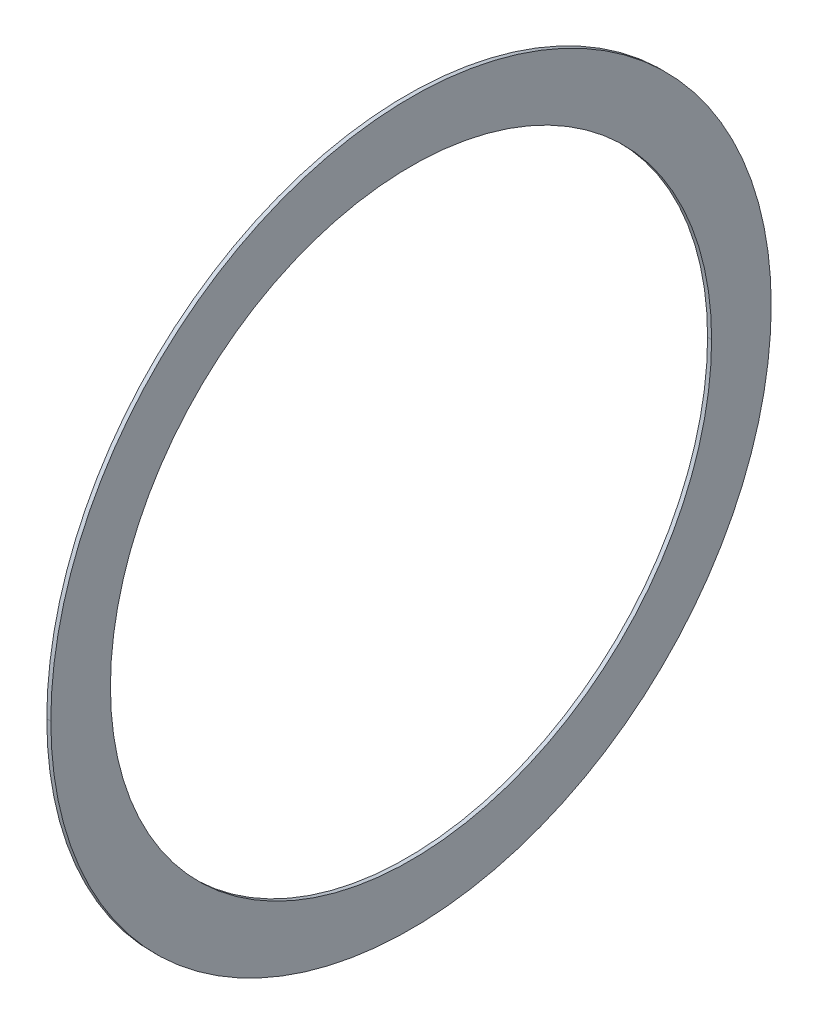
ISO-10303-21;
HEADER;
FILE_DESCRIPTION(('STEP AP214'),'2;1');
FILE_NAME('part.step','',(''),(''),'','','');
FILE_SCHEMA(('AUTOMOTIVE_DESIGN { 1 0 10303 214 1 1 1 1 }'));
ENDSEC;
DATA;
#1=APPLICATION_CONTEXT('core data for automotive mechanical design processes');
#2=APPLICATION_PROTOCOL_DEFINITION('international standard','automotive_design',2000,#1);
#3=PRODUCT_CONTEXT('',#1,'mechanical');
#4=PRODUCT('Part','Part','',(#3));
#5=PRODUCT_RELATED_PRODUCT_CATEGORY('part','',(#4));
#6=PRODUCT_DEFINITION_FORMATION('','',#4);
#7=PRODUCT_DEFINITION_CONTEXT('part definition',#1,'design');
#8=PRODUCT_DEFINITION('design','',#6,#7);
#9=PRODUCT_DEFINITION_SHAPE('','',#8);
#10=(LENGTH_UNIT() NAMED_UNIT(*) SI_UNIT(.MILLI.,.METRE.));
#11=(NAMED_UNIT(*) PLANE_ANGLE_UNIT() SI_UNIT($,.RADIAN.));
#12=(NAMED_UNIT(*) SI_UNIT($,.STERADIAN.) SOLID_ANGLE_UNIT());
#13=UNCERTAINTY_MEASURE_WITH_UNIT(LENGTH_MEASURE(1.E-05),#10,'distance_accuracy_value','');
#14=(GEOMETRIC_REPRESENTATION_CONTEXT(3) GLOBAL_UNCERTAINTY_ASSIGNED_CONTEXT((#13)) GLOBAL_UNIT_ASSIGNED_CONTEXT((#10,
#11,#12)) REPRESENTATION_CONTEXT('',''));
#15=CARTESIAN_POINT('',(0.,0.,0.));
#16=DIRECTION('',(0.,0.,1.));
#17=DIRECTION('',(1.,0.,0.));
#18=AXIS2_PLACEMENT_3D('',#15,#16,#17);
#19=CARTESIAN_POINT('',(0.,49.25,0.));
#20=DIRECTION('',(-1.,0.,0.));
#21=DIRECTION('',(0.,0.,1.));
#22=AXIS2_PLACEMENT_3D('',#19,#20,#21);
#23=PLANE('',#22);
#24=CARTESIAN_POINT('',(0.,0.,0.));
#25=DIRECTION('',(1.,0.,0.));
#26=DIRECTION('',(0.,0.,-1.));
#27=AXIS2_PLACEMENT_3D('',#24,#25,#26);
#28=CIRCLE('',#27,41.1);
#29=CARTESIAN_POINT('',(0.,0.,-41.1));
#30=VERTEX_POINT('',#29);
#31=CARTESIAN_POINT('',(0.,0.,41.1));
#32=VERTEX_POINT('',#31);
#33=EDGE_CURVE('E11',#30,#32,#28,.T.);
#34=ORIENTED_EDGE('',*,*,#33,.T.);
#35=CARTESIAN_POINT('',(0.,0.,0.));
#36=DIRECTION('',(1.,0.,0.));
#37=DIRECTION('',(0.,0.,-1.));
#38=AXIS2_PLACEMENT_3D('',#35,#36,#37);
#39=CIRCLE('',#38,41.1);
#40=EDGE_CURVE('E27',#32,#30,#39,.T.);
#41=ORIENTED_EDGE('',*,*,#40,.T.);
#42=EDGE_LOOP('',(#34,#41));
#43=FACE_BOUND('',#42,.T.);
#44=CARTESIAN_POINT('',(0.,0.,0.));
#45=DIRECTION('',(1.,0.,0.));
#46=DIRECTION('',(0.,0.,-1.));
#47=AXIS2_PLACEMENT_3D('',#44,#45,#46);
#48=CIRCLE('',#47,49.25);
#49=CARTESIAN_POINT('',(0.,0.,49.25));
#50=VERTEX_POINT('',#49);
#51=CARTESIAN_POINT('',(0.,0.,-49.25));
#52=VERTEX_POINT('',#51);
#53=EDGE_CURVE('E97',#50,#52,#48,.T.);
#54=ORIENTED_EDGE('',*,*,#53,.F.);
#55=CARTESIAN_POINT('',(0.,0.,0.));
#56=DIRECTION('',(1.,0.,0.));
#57=DIRECTION('',(0.,0.,-1.));
#58=AXIS2_PLACEMENT_3D('',#55,#56,#57);
#59=CIRCLE('',#58,49.25);
#60=EDGE_CURVE('E92',#52,#50,#59,.T.);
#61=ORIENTED_EDGE('',*,*,#60,.F.);
#62=EDGE_LOOP('',(#54,#61));
#63=FACE_BOUND('',#62,.T.);
#64=ADVANCED_FACE('F19',(#43,#63),#23,.T.);
#65=CARTESIAN_POINT('',(0.552,0.,0.));
#66=DIRECTION('',(1.,0.,0.));
#67=DIRECTION('',(0.,-1.,0.));
#68=AXIS2_PLACEMENT_3D('',#65,#66,#67);
#69=CYLINDRICAL_SURFACE('',#68,49.25);
#70=DIRECTION('',(1.,0.,0.));
#71=VECTOR('',#70,1.);
#72=CARTESIAN_POINT('',(0.,0.,49.25));
#73=LINE('',#72,#71);
#74=CARTESIAN_POINT('',(0.552,0.,49.25));
#75=VERTEX_POINT('',#74);
#76=EDGE_CURVE('E88',#50,#75,#73,.T.);
#77=ORIENTED_EDGE('',*,*,#76,.T.);
#78=CARTESIAN_POINT('',(0.552,0.,0.));
#79=DIRECTION('',(1.,0.,0.));
#80=DIRECTION('',(0.,0.,-1.));
#81=AXIS2_PLACEMENT_3D('',#78,#79,#80);
#82=CIRCLE('',#81,49.25);
#83=CARTESIAN_POINT('',(0.552,0.,-49.25));
#84=VERTEX_POINT('',#83);
#85=EDGE_CURVE('E83',#84,#75,#82,.T.);
#86=ORIENTED_EDGE('',*,*,#85,.F.);
#87=DIRECTION('',(1.,0.,0.));
#88=VECTOR('',#87,1.);
#89=CARTESIAN_POINT('',(0.,0.,-49.25));
#90=LINE('',#89,#88);
#91=EDGE_CURVE('E72',#52,#84,#90,.T.);
#92=ORIENTED_EDGE('',*,*,#91,.F.);
#93=ORIENTED_EDGE('',*,*,#60,.T.);
#94=EDGE_LOOP('',(#77,#86,#92,#93));
#95=FACE_BOUND('',#94,.T.);
#96=ADVANCED_FACE('F113',(#95),#69,.T.);
#97=CARTESIAN_POINT('',(0.552,0.,0.));
#98=DIRECTION('',(1.,0.,0.));
#99=DIRECTION('',(0.,1.,0.));
#100=AXIS2_PLACEMENT_3D('',#97,#98,#99);
#101=CYLINDRICAL_SURFACE('',#100,49.25);
#102=ORIENTED_EDGE('',*,*,#76,.F.);
#103=ORIENTED_EDGE('',*,*,#53,.T.);
#104=ORIENTED_EDGE('',*,*,#91,.T.);
#105=CARTESIAN_POINT('',(0.552,0.,0.));
#106=DIRECTION('',(1.,0.,0.));
#107=DIRECTION('',(0.,0.,-1.));
#108=AXIS2_PLACEMENT_3D('',#105,#106,#107);
#109=CIRCLE('',#108,49.25);
#110=EDGE_CURVE('E69',#75,#84,#109,.T.);
#111=ORIENTED_EDGE('',*,*,#110,.F.);
#112=EDGE_LOOP('',(#102,#103,#104,#111));
#113=FACE_BOUND('',#112,.T.);
#114=ADVANCED_FACE('F108',(#113),#101,.T.);
#115=CARTESIAN_POINT('',(0.552,41.1,0.));
#116=DIRECTION('',(1.,0.,0.));
#117=DIRECTION('',(0.,0.,-1.));
#118=AXIS2_PLACEMENT_3D('',#115,#116,#117);
#119=PLANE('',#118);
#120=ORIENTED_EDGE('',*,*,#85,.T.);
#121=ORIENTED_EDGE('',*,*,#110,.T.);
#122=EDGE_LOOP('',(#120,#121));
#123=FACE_BOUND('',#122,.T.);
#124=CARTESIAN_POINT('',(0.552,0.,0.));
#125=DIRECTION('',(1.,0.,0.));
#126=DIRECTION('',(0.,0.,-1.));
#127=AXIS2_PLACEMENT_3D('',#124,#125,#126);
#128=CIRCLE('',#127,41.1);
#129=CARTESIAN_POINT('',(0.552,0.,41.1));
#130=VERTEX_POINT('',#129);
#131=CARTESIAN_POINT('',(0.552,0.,-41.1));
#132=VERTEX_POINT('',#131);
#133=EDGE_CURVE('E57',#130,#132,#128,.T.);
#134=ORIENTED_EDGE('',*,*,#133,.F.);
#135=CARTESIAN_POINT('',(0.552,0.,0.));
#136=DIRECTION('',(1.,0.,0.));
#137=DIRECTION('',(0.,0.,-1.));
#138=AXIS2_PLACEMENT_3D('',#135,#136,#137);
#139=CIRCLE('',#138,41.1);
#140=EDGE_CURVE('E53',#132,#130,#139,.T.);
#141=ORIENTED_EDGE('',*,*,#140,.F.);
#142=EDGE_LOOP('',(#134,#141));
#143=FACE_BOUND('',#142,.T.);
#144=ADVANCED_FACE('F55',(#123,#143),#119,.T.);
#145=CARTESIAN_POINT('',(0.552,0.,0.));
#146=DIRECTION('',(1.,0.,0.));
#147=DIRECTION('',(0.,-1.,0.));
#148=AXIS2_PLACEMENT_3D('',#145,#146,#147);
#149=CYLINDRICAL_SURFACE('',#148,41.1);
#150=DIRECTION('',(1.,0.,0.));
#151=VECTOR('',#150,1.);
#152=CARTESIAN_POINT('',(0.,0.,41.1));
#153=LINE('',#152,#151);
#154=EDGE_CURVE('E61',#32,#130,#153,.T.);
#155=ORIENTED_EDGE('',*,*,#154,.F.);
#156=ORIENTED_EDGE('',*,*,#33,.F.);
#157=DIRECTION('',(1.,0.,0.));
#158=VECTOR('',#157,1.);
#159=CARTESIAN_POINT('',(0.,0.,-41.1));
#160=LINE('',#159,#158);
#161=EDGE_CURVE('E64',#30,#132,#160,.T.);
#162=ORIENTED_EDGE('',*,*,#161,.T.);
#163=ORIENTED_EDGE('',*,*,#140,.T.);
#164=EDGE_LOOP('',(#155,#156,#162,#163));
#165=FACE_BOUND('',#164,.T.);
#166=ADVANCED_FACE('F65',(#165),#149,.F.);
#167=CARTESIAN_POINT('',(0.552,0.,0.));
#168=DIRECTION('',(1.,0.,0.));
#169=DIRECTION('',(0.,1.,0.));
#170=AXIS2_PLACEMENT_3D('',#167,#168,#169);
#171=CYLINDRICAL_SURFACE('',#170,41.1);
#172=ORIENTED_EDGE('',*,*,#154,.T.);
#173=ORIENTED_EDGE('',*,*,#133,.T.);
#174=ORIENTED_EDGE('',*,*,#161,.F.);
#175=ORIENTED_EDGE('',*,*,#40,.F.);
#176=EDGE_LOOP('',(#172,#173,#174,#175));
#177=FACE_BOUND('',#176,.T.);
#178=ADVANCED_FACE('F68',(#177),#171,.F.);
#179=CLOSED_SHELL('',(#64,#96,#114,#144,#166,#178));
#180=MANIFOLD_SOLID_BREP('B1',#179);
#181=ADVANCED_BREP_SHAPE_REPRESENTATION('',(#18,#180),#14);
#182=SHAPE_DEFINITION_REPRESENTATION(#9,#181);
ENDSEC;
END-ISO-10303-21;
